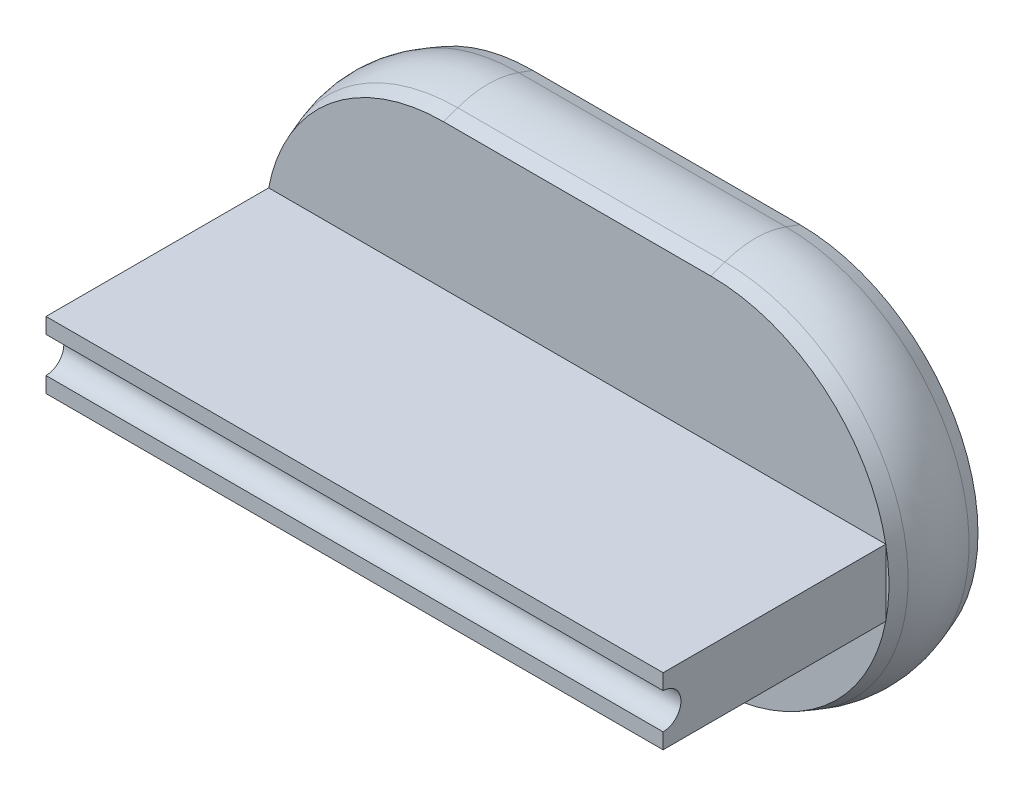
ISO-10303-21;
HEADER;
FILE_DESCRIPTION(('STEP AP214'),'2;1');
FILE_NAME('part.step','',(''),(''),'','','');
FILE_SCHEMA(('AUTOMOTIVE_DESIGN { 1 0 10303 214 1 1 1 1 }'));
ENDSEC;
DATA;
#1=APPLICATION_CONTEXT('core data for automotive mechanical design processes');
#2=APPLICATION_PROTOCOL_DEFINITION('international standard','automotive_design',2000,#1);
#3=PRODUCT_CONTEXT('',#1,'mechanical');
#4=PRODUCT('Part','Part','',(#3));
#5=PRODUCT_RELATED_PRODUCT_CATEGORY('part','',(#4));
#6=PRODUCT_DEFINITION_FORMATION('','',#4);
#7=PRODUCT_DEFINITION_CONTEXT('part definition',#1,'design');
#8=PRODUCT_DEFINITION('design','',#6,#7);
#9=PRODUCT_DEFINITION_SHAPE('','',#8);
#10=(LENGTH_UNIT() NAMED_UNIT(*) SI_UNIT(.MILLI.,.METRE.));
#11=(NAMED_UNIT(*) PLANE_ANGLE_UNIT() SI_UNIT($,.RADIAN.));
#12=(NAMED_UNIT(*) SI_UNIT($,.STERADIAN.) SOLID_ANGLE_UNIT());
#13=UNCERTAINTY_MEASURE_WITH_UNIT(LENGTH_MEASURE(1.E-05),#10,'distance_accuracy_value','');
#14=(GEOMETRIC_REPRESENTATION_CONTEXT(3) GLOBAL_UNCERTAINTY_ASSIGNED_CONTEXT((#13)) GLOBAL_UNIT_ASSIGNED_CONTEXT((#10,
#11,#12)) REPRESENTATION_CONTEXT('',''));
#15=CARTESIAN_POINT('',(0.,0.,0.));
#16=DIRECTION('',(0.,0.,1.));
#17=DIRECTION('',(1.,0.,0.));
#18=AXIS2_PLACEMENT_3D('',#15,#16,#17);
#19=CARTESIAN_POINT('',(-40.4386499904565,-3.75,25.));
#20=DIRECTION('',(1.,0.,0.));
#21=DIRECTION('',(0.,0.,-1.));
#22=AXIS2_PLACEMENT_3D('',#19,#20,#21);
#23=PLANE('',#22);
#24=CARTESIAN_POINT('',(-40.4386499904565,0.,25.));
#25=DIRECTION('',(1.,0.,0.));
#26=DIRECTION('',(0.,0.,-1.));
#27=AXIS2_PLACEMENT_3D('',#24,#25,#26);
#28=CIRCLE('',#27,2.);
#29=CARTESIAN_POINT('',(-40.4386499904565,-2.,25.));
#30=VERTEX_POINT('',#29);
#31=CARTESIAN_POINT('',(-40.4386499904565,2.,25.));
#32=VERTEX_POINT('',#31);
#33=EDGE_CURVE('E179',#30,#32,#28,.T.);
#34=ORIENTED_EDGE('',*,*,#33,.T.);
#35=DIRECTION('',(0.,-1.,0.));
#36=VECTOR('',#35,1.);
#37=CARTESIAN_POINT('',(-40.4386499904565,-3.75,25.));
#38=LINE('',#37,#36);
#39=CARTESIAN_POINT('',(-40.4386499904565,3.75,25.));
#40=VERTEX_POINT('',#39);
#41=EDGE_CURVE('E184',#40,#32,#38,.T.);
#42=ORIENTED_EDGE('',*,*,#41,.F.);
#43=DIRECTION('',(0.,0.,-1.));
#44=VECTOR('',#43,1.);
#45=CARTESIAN_POINT('',(-40.4386499904565,3.75,25.));
#46=LINE('',#45,#44);
#47=CARTESIAN_POINT('',(-40.4386499904565,3.75,0.));
#48=VERTEX_POINT('',#47);
#49=EDGE_CURVE('E189',#40,#48,#46,.T.);
#50=ORIENTED_EDGE('',*,*,#49,.T.);
#51=DIRECTION('',(0.,-1.,0.));
#52=VECTOR('',#51,1.);
#53=CARTESIAN_POINT('',(-40.4386499904565,-3.75,0.));
#54=LINE('',#53,#52);
#55=CARTESIAN_POINT('',(-40.4386499904565,-3.75,0.));
#56=VERTEX_POINT('',#55);
#57=EDGE_CURVE('E175',#48,#56,#54,.T.);
#58=ORIENTED_EDGE('',*,*,#57,.T.);
#59=DIRECTION('',(0.,0.,-1.));
#60=VECTOR('',#59,1.);
#61=CARTESIAN_POINT('',(-40.4386499904565,-3.75,25.));
#62=LINE('',#61,#60);
#63=CARTESIAN_POINT('',(-40.4386499904565,-3.75,25.));
#64=VERTEX_POINT('',#63);
#65=EDGE_CURVE('E208',#64,#56,#62,.T.);
#66=ORIENTED_EDGE('',*,*,#65,.F.);
#67=EDGE_CURVE('E186',#30,#64,#38,.T.);
#68=ORIENTED_EDGE('',*,*,#67,.F.);
#69=EDGE_LOOP('',(#34,#42,#50,#58,#66,#68));
#70=FACE_BOUND('',#69,.T.);
#71=ADVANCED_FACE('F34',(#70),#23,.F.);
#72=CARTESIAN_POINT('',(28.8519341232978,-3.75,25.));
#73=DIRECTION('',(-1.,0.,0.));
#74=DIRECTION('',(0.,0.,1.));
#75=AXIS2_PLACEMENT_3D('',#72,#73,#74);
#76=PLANE('',#75);
#77=CARTESIAN_POINT('',(28.8519341232978,0.,25.));
#78=DIRECTION('',(-1.,0.,0.));
#79=DIRECTION('',(0.,0.,1.));
#80=AXIS2_PLACEMENT_3D('',#77,#78,#79);
#81=CIRCLE('',#80,2.);
#82=CARTESIAN_POINT('',(28.8519341232978,-2.,25.));
#83=VERTEX_POINT('',#82);
#84=CARTESIAN_POINT('',(28.8519341232978,2.,25.));
#85=VERTEX_POINT('',#84);
#86=EDGE_CURVE('E171',#83,#85,#81,.F.);
#87=ORIENTED_EDGE('',*,*,#86,.F.);
#88=DIRECTION('',(0.,1.,0.));
#89=VECTOR('',#88,1.);
#90=CARTESIAN_POINT('',(28.8519341232978,-3.75,25.));
#91=LINE('',#90,#89);
#92=CARTESIAN_POINT('',(28.8519341232978,-3.75,25.));
#93=VERTEX_POINT('',#92);
#94=EDGE_CURVE('E159',#93,#83,#91,.T.);
#95=ORIENTED_EDGE('',*,*,#94,.F.);
#96=DIRECTION('',(0.,0.,-1.));
#97=VECTOR('',#96,1.);
#98=CARTESIAN_POINT('',(28.8519341232978,-3.75,25.));
#99=LINE('',#98,#97);
#100=CARTESIAN_POINT('',(28.8519341232978,-3.75,0.));
#101=VERTEX_POINT('',#100);
#102=EDGE_CURVE('E206',#93,#101,#99,.T.);
#103=ORIENTED_EDGE('',*,*,#102,.T.);
#104=DIRECTION('',(0.,1.,0.));
#105=VECTOR('',#104,1.);
#106=CARTESIAN_POINT('',(28.8519341232978,-3.75,0.));
#107=LINE('',#106,#105);
#108=CARTESIAN_POINT('',(28.8519341232978,3.75,0.));
#109=VERTEX_POINT('',#108);
#110=EDGE_CURVE('E195',#101,#109,#107,.T.);
#111=ORIENTED_EDGE('',*,*,#110,.T.);
#112=DIRECTION('',(0.,0.,-1.));
#113=VECTOR('',#112,1.);
#114=CARTESIAN_POINT('',(28.8519341232978,3.75,25.));
#115=LINE('',#114,#113);
#116=CARTESIAN_POINT('',(28.8519341232978,3.75,25.));
#117=VERTEX_POINT('',#116);
#118=EDGE_CURVE('E203',#117,#109,#115,.T.);
#119=ORIENTED_EDGE('',*,*,#118,.F.);
#120=EDGE_CURVE('E168',#85,#117,#91,.T.);
#121=ORIENTED_EDGE('',*,*,#120,.F.);
#122=EDGE_LOOP('',(#87,#95,#103,#111,#119,#121));
#123=FACE_BOUND('',#122,.T.);
#124=ADVANCED_FACE('F172',(#123),#76,.F.);
#125=CARTESIAN_POINT('',(0.,0.,25.));
#126=DIRECTION('',(0.,0.,-1.));
#127=DIRECTION('',(-1.,0.,0.));
#128=AXIS2_PLACEMENT_3D('',#125,#126,#127);
#129=PLANE('',#128);
#130=DIRECTION('',(1.,0.,0.));
#131=VECTOR('',#130,1.);
#132=CARTESIAN_POINT('',(-154.006190280749,2.,25.));
#133=LINE('',#132,#131);
#134=EDGE_CURVE('E51',#32,#85,#133,.T.);
#135=ORIENTED_EDGE('',*,*,#134,.T.);
#136=ORIENTED_EDGE('',*,*,#120,.T.);
#137=DIRECTION('',(-1.,0.,0.));
#138=VECTOR('',#137,1.);
#139=CARTESIAN_POINT('',(-40.4386499904565,3.75,25.));
#140=LINE('',#139,#138);
#141=EDGE_CURVE('E167',#117,#40,#140,.T.);
#142=ORIENTED_EDGE('',*,*,#141,.T.);
#143=ORIENTED_EDGE('',*,*,#41,.T.);
#144=EDGE_LOOP('',(#135,#136,#142,#143));
#145=FACE_BOUND('',#144,.T.);
#146=ADVANCED_FACE('F375',(#145),#129,.F.);
#147=DIRECTION('',(1.,0.,0.));
#148=VECTOR('',#147,1.);
#149=CARTESIAN_POINT('',(-154.006190280749,-2.,25.));
#150=LINE('',#149,#148);
#151=EDGE_CURVE('E59',#30,#83,#150,.T.);
#152=ORIENTED_EDGE('',*,*,#151,.F.);
#153=ORIENTED_EDGE('',*,*,#67,.T.);
#154=DIRECTION('',(1.,0.,0.));
#155=VECTOR('',#154,1.);
#156=CARTESIAN_POINT('',(-40.4386499904565,-3.75,25.));
#157=LINE('',#156,#155);
#158=EDGE_CURVE('E163',#64,#93,#157,.T.);
#159=ORIENTED_EDGE('',*,*,#158,.T.);
#160=ORIENTED_EDGE('',*,*,#94,.T.);
#161=EDGE_LOOP('',(#152,#153,#159,#160));
#162=FACE_BOUND('',#161,.T.);
#163=ADVANCED_FACE('F161',(#162),#129,.F.);
#164=CARTESIAN_POINT('',(-20.7933579335793,0.,0.));
#165=DIRECTION('',(0.,0.,1.));
#166=DIRECTION('',(1.,0.,0.));
#167=AXIS2_PLACEMENT_3D('',#164,#165,#166);
#168=PLANE('',#167);
#169=ORIENTED_EDGE('',*,*,#57,.F.);
#170=CARTESIAN_POINT('',(-20.7933579335793,0.,0.));
#171=DIRECTION('',(0.,0.,1.));
#172=DIRECTION('',(1.,0.,0.));
#173=AXIS2_PLACEMENT_3D('',#170,#171,#172);
#174=CIRCLE('',#173,20.);
#175=EDGE_CURVE('E275',#48,#56,#174,.T.);
#176=ORIENTED_EDGE('',*,*,#175,.T.);
#177=EDGE_LOOP('',(#169,#176));
#178=FACE_BOUND('',#177,.T.);
#179=ADVANCED_FACE('F390',(#178),#168,.T.);
#180=DIRECTION('',(-1.,0.,0.));
#181=VECTOR('',#180,1.);
#182=CARTESIAN_POINT('',(-40.4386499904565,3.75,0.));
#183=LINE('',#182,#181);
#184=EDGE_CURVE('E198',#109,#48,#183,.T.);
#185=ORIENTED_EDGE('',*,*,#184,.F.);
#186=CARTESIAN_POINT('',(9.20664206642069,0.,0.));
#187=DIRECTION('',(0.,0.,1.));
#188=DIRECTION('',(1.,0.,0.));
#189=AXIS2_PLACEMENT_3D('',#186,#187,#188);
#190=CIRCLE('',#189,20.);
#191=CARTESIAN_POINT('',(9.20664206642069,20.,0.));
#192=VERTEX_POINT('',#191);
#193=EDGE_CURVE('E278',#109,#192,#190,.T.);
#194=ORIENTED_EDGE('',*,*,#193,.T.);
#195=DIRECTION('',(-1.,0.,0.));
#196=VECTOR('',#195,1.);
#197=CARTESIAN_POINT('',(-20.7933579335793,20.,0.));
#198=LINE('',#197,#196);
#199=CARTESIAN_POINT('',(-20.7933579335793,20.,0.));
#200=VERTEX_POINT('',#199);
#201=EDGE_CURVE('E281',#192,#200,#198,.T.);
#202=ORIENTED_EDGE('',*,*,#201,.T.);
#203=EDGE_CURVE('E271',#200,#48,#174,.T.);
#204=ORIENTED_EDGE('',*,*,#203,.T.);
#205=EDGE_LOOP('',(#185,#194,#202,#204));
#206=FACE_BOUND('',#205,.T.);
#207=ADVANCED_FACE('F364',(#206),#168,.T.);
#208=ORIENTED_EDGE('',*,*,#110,.F.);
#209=EDGE_CURVE('E282',#101,#109,#190,.T.);
#210=ORIENTED_EDGE('',*,*,#209,.T.);
#211=EDGE_LOOP('',(#208,#210));
#212=FACE_BOUND('',#211,.T.);
#213=ADVANCED_FACE('F369',(#212),#168,.T.);
#214=CARTESIAN_POINT('',(-20.7933579335793,0.,0.));
#215=DIRECTION('',(0.,0.,-1.));
#216=DIRECTION('',(1.,0.,0.));
#217=AXIS2_PLACEMENT_3D('',#214,#215,#216);
#218=CONICAL_SURFACE('',#217,20.,0.349065850398867);
#219=DIRECTION('',(0.,0.342020143325669,-0.939692620785908));
#220=VECTOR('',#219,1.);
#221=CARTESIAN_POINT('',(-20.7933579335793,20.,0.));
#222=LINE('',#221,#220);
#223=CARTESIAN_POINT('',(-20.7933579335793,20.574999654431,-1.57979856674331));
#224=VERTEX_POINT('',#223);
#225=EDGE_CURVE('E286',#224,#200,#222,.F.);
#226=ORIENTED_EDGE('',*,*,#225,.F.);
#227=CARTESIAN_POINT('',(-20.7933579335793,0.,-1.5797985667433));
#228=DIRECTION('',(0.,0.,-1.));
#229=DIRECTION('',(-1.,0.,0.));
#230=AXIS2_PLACEMENT_3D('',#227,#228,#229);
#231=CIRCLE('',#230,20.574999654431);
#232=CARTESIAN_POINT('',(-20.7933579335793,-20.574999654431,-1.5797985667433));
#233=VERTEX_POINT('',#232);
#234=EDGE_CURVE('E305',#224,#233,#231,.F.);
#235=ORIENTED_EDGE('',*,*,#234,.T.);
#236=DIRECTION('',(0.,-0.342020143325669,-0.939692620785908));
#237=VECTOR('',#236,1.);
#238=CARTESIAN_POINT('',(-20.7933579335793,-20.,0.));
#239=LINE('',#238,#237);
#240=CARTESIAN_POINT('',(-20.7933579335793,-20.,0.));
#241=VERTEX_POINT('',#240);
#242=EDGE_CURVE('E285',#233,#241,#239,.F.);
#243=ORIENTED_EDGE('',*,*,#242,.T.);
#244=EDGE_CURVE('E265',#56,#241,#174,.T.);
#245=ORIENTED_EDGE('',*,*,#244,.F.);
#246=ORIENTED_EDGE('',*,*,#175,.F.);
#247=ORIENTED_EDGE('',*,*,#203,.F.);
#248=EDGE_LOOP('',(#226,#235,#243,#245,#246,#247));
#249=FACE_BOUND('',#248,.T.);
#250=ADVANCED_FACE('F386',(#249),#218,.T.);
#251=CARTESIAN_POINT('',(-20.7933579335793,20.,0.));
#252=DIRECTION('',(0.,0.939692620785908,0.342020143325669));
#253=DIRECTION('',(0.,-0.342020143325669,0.939692620785908));
#254=AXIS2_PLACEMENT_3D('',#251,#252,#253);
#255=PLANE('',#254);
#256=DIRECTION('',(0.,0.342020143325669,-0.939692620785908));
#257=VECTOR('',#256,1.);
#258=CARTESIAN_POINT('',(9.20664206642068,20.,0.));
#259=LINE('',#258,#257);
#260=CARTESIAN_POINT('',(9.20664206642068,20.574999654431,-1.57979856674331));
#261=VERTEX_POINT('',#260);
#262=EDGE_CURVE('E289',#261,#192,#259,.F.);
#263=ORIENTED_EDGE('',*,*,#262,.F.);
#264=DIRECTION('',(1.,0.,0.));
#265=VECTOR('',#264,1.);
#266=CARTESIAN_POINT('',(-20.7933579335793,20.574999654431,-1.57979856674331));
#267=LINE('',#266,#265);
#268=EDGE_CURVE('E43',#261,#224,#267,.F.);
#269=ORIENTED_EDGE('',*,*,#268,.T.);
#270=ORIENTED_EDGE('',*,*,#225,.T.);
#271=ORIENTED_EDGE('',*,*,#201,.F.);
#272=EDGE_LOOP('',(#263,#269,#270,#271));
#273=FACE_BOUND('',#272,.T.);
#274=ADVANCED_FACE('F361',(#273),#255,.T.);
#275=CARTESIAN_POINT('',(9.20664206642069,0.,0.));
#276=DIRECTION('',(0.,0.,-1.));
#277=DIRECTION('',(1.,0.,0.));
#278=AXIS2_PLACEMENT_3D('',#275,#276,#277);
#279=CONICAL_SURFACE('',#278,20.,0.349065850398867);
#280=DIRECTION('',(0.,-0.342020143325669,-0.939692620785908));
#281=VECTOR('',#280,1.);
#282=CARTESIAN_POINT('',(9.20664206642068,-20.,0.));
#283=LINE('',#282,#281);
#284=CARTESIAN_POINT('',(9.20664206642068,-20.574999654431,-1.57979856674331));
#285=VERTEX_POINT('',#284);
#286=CARTESIAN_POINT('',(9.20664206642068,-20.,0.));
#287=VERTEX_POINT('',#286);
#288=EDGE_CURVE('E292',#285,#287,#283,.F.);
#289=ORIENTED_EDGE('',*,*,#288,.F.);
#290=CARTESIAN_POINT('',(9.20664206642069,0.,-1.57979856674331));
#291=DIRECTION('',(0.,0.,-1.));
#292=DIRECTION('',(-1.,0.,0.));
#293=AXIS2_PLACEMENT_3D('',#290,#291,#292);
#294=CIRCLE('',#293,20.574999654431);
#295=EDGE_CURVE('E288',#285,#261,#294,.F.);
#296=ORIENTED_EDGE('',*,*,#295,.T.);
#297=ORIENTED_EDGE('',*,*,#262,.T.);
#298=ORIENTED_EDGE('',*,*,#193,.F.);
#299=ORIENTED_EDGE('',*,*,#209,.F.);
#300=EDGE_CURVE('E279',#287,#101,#190,.T.);
#301=ORIENTED_EDGE('',*,*,#300,.F.);
#302=EDGE_LOOP('',(#289,#296,#297,#298,#299,#301));
#303=FACE_BOUND('',#302,.T.);
#304=ADVANCED_FACE('F357',(#303),#279,.T.);
#305=CARTESIAN_POINT('',(-20.7933579335793,-20.,0.));
#306=DIRECTION('',(0.,-0.939692620785908,0.342020143325669));
#307=DIRECTION('',(0.,-0.342020143325669,-0.939692620785908));
#308=AXIS2_PLACEMENT_3D('',#305,#306,#307);
#309=PLANE('',#308);
#310=ORIENTED_EDGE('',*,*,#242,.F.);
#311=DIRECTION('',(-1.,0.,0.));
#312=VECTOR('',#311,1.);
#313=CARTESIAN_POINT('',(9.20664206642068,-20.574999654431,-1.57979856674331));
#314=LINE('',#313,#312);
#315=EDGE_CURVE('E301',#233,#285,#314,.F.);
#316=ORIENTED_EDGE('',*,*,#315,.T.);
#317=ORIENTED_EDGE('',*,*,#288,.T.);
#318=DIRECTION('',(1.,0.,0.));
#319=VECTOR('',#318,1.);
#320=CARTESIAN_POINT('',(-20.7933579335793,-20.,0.));
#321=LINE('',#320,#319);
#322=EDGE_CURVE('E274',#241,#287,#321,.T.);
#323=ORIENTED_EDGE('',*,*,#322,.F.);
#324=EDGE_LOOP('',(#310,#316,#317,#323));
#325=FACE_BOUND('',#324,.T.);
#326=ADVANCED_FACE('F401',(#325),#309,.T.);
#327=DIRECTION('',(1.,0.,0.));
#328=VECTOR('',#327,1.);
#329=CARTESIAN_POINT('',(-40.4386499904565,-3.75,0.));
#330=LINE('',#329,#328);
#331=EDGE_CURVE('E192',#56,#101,#330,.T.);
#332=ORIENTED_EDGE('',*,*,#331,.F.);
#333=ORIENTED_EDGE('',*,*,#244,.T.);
#334=ORIENTED_EDGE('',*,*,#322,.T.);
#335=ORIENTED_EDGE('',*,*,#300,.T.);
#336=EDGE_LOOP('',(#332,#333,#334,#335));
#337=FACE_BOUND('',#336,.T.);
#338=ADVANCED_FACE('F382',(#337),#168,.T.);
#339=CARTESIAN_POINT('',(-20.7933579335793,0.,-10.));
#340=DIRECTION('',(0.,0.,1.));
#341=DIRECTION('',(1.,0.,0.));
#342=AXIS2_PLACEMENT_3D('',#339,#340,#341);
#343=CONICAL_SURFACE('',#342,20.,0.349065850398867);
#344=DIRECTION('',(0.,-0.342020143325669,0.939692620785908));
#345=VECTOR('',#344,1.);
#346=CARTESIAN_POINT('',(-20.7933579335793,-20.,-10.));
#347=LINE('',#346,#345);
#348=CARTESIAN_POINT('',(-20.7933579335793,-20.574999654431,-8.4202014332567));
#349=VERTEX_POINT('',#348);
#350=CARTESIAN_POINT('',(-20.7933579335793,-20.,-10.));
#351=VERTEX_POINT('',#350);
#352=EDGE_CURVE('E263',#349,#351,#347,.F.);
#353=ORIENTED_EDGE('',*,*,#352,.F.);
#354=CARTESIAN_POINT('',(-20.7933579335793,0.,-8.42020143325669));
#355=DIRECTION('',(0.,0.,1.));
#356=DIRECTION('',(1.,0.,0.));
#357=AXIS2_PLACEMENT_3D('',#354,#355,#356);
#358=CIRCLE('',#357,20.574999654431);
#359=CARTESIAN_POINT('',(-20.7933579335793,20.574999654431,-8.4202014332567));
#360=VERTEX_POINT('',#359);
#361=EDGE_CURVE('E307',#349,#360,#358,.F.);
#362=ORIENTED_EDGE('',*,*,#361,.T.);
#363=DIRECTION('',(0.,0.342020143325669,0.939692620785908));
#364=VECTOR('',#363,1.);
#365=CARTESIAN_POINT('',(-20.7933579335793,20.,-10.));
#366=LINE('',#365,#364);
#367=CARTESIAN_POINT('',(-20.7933579335793,20.,-10.));
#368=VERTEX_POINT('',#367);
#369=EDGE_CURVE('E262',#360,#368,#366,.F.);
#370=ORIENTED_EDGE('',*,*,#369,.T.);
#371=CARTESIAN_POINT('',(-20.7933579335793,0.,-10.));
#372=DIRECTION('',(0.,0.,1.));
#373=DIRECTION('',(1.,0.,0.));
#374=AXIS2_PLACEMENT_3D('',#371,#372,#373);
#375=CIRCLE('',#374,20.);
#376=EDGE_CURVE('E250',#368,#351,#375,.T.);
#377=ORIENTED_EDGE('',*,*,#376,.T.);
#378=EDGE_LOOP('',(#353,#362,#370,#377));
#379=FACE_BOUND('',#378,.T.);
#380=ADVANCED_FACE('F331',(#379),#343,.T.);
#381=CARTESIAN_POINT('',(-20.7933579335793,-20.,-10.));
#382=DIRECTION('',(0.,-0.939692620785908,-0.342020143325669));
#383=DIRECTION('',(0.,0.342020143325669,-0.939692620785908));
#384=AXIS2_PLACEMENT_3D('',#381,#382,#383);
#385=PLANE('',#384);
#386=DIRECTION('',(0.,-0.342020143325669,0.939692620785908));
#387=VECTOR('',#386,1.);
#388=CARTESIAN_POINT('',(9.20664206642068,-20.,-10.));
#389=LINE('',#388,#387);
#390=CARTESIAN_POINT('',(9.20664206642068,-20.574999654431,-8.4202014332567));
#391=VERTEX_POINT('',#390);
#392=CARTESIAN_POINT('',(9.20664206642068,-20.,-10.));
#393=VERTEX_POINT('',#392);
#394=EDGE_CURVE('E266',#391,#393,#389,.F.);
#395=ORIENTED_EDGE('',*,*,#394,.F.);
#396=DIRECTION('',(1.,0.,0.));
#397=VECTOR('',#396,1.);
#398=CARTESIAN_POINT('',(-20.7933579335793,-20.574999654431,-8.4202014332567));
#399=LINE('',#398,#397);
#400=EDGE_CURVE('E303',#391,#349,#399,.F.);
#401=ORIENTED_EDGE('',*,*,#400,.T.);
#402=ORIENTED_EDGE('',*,*,#352,.T.);
#403=DIRECTION('',(1.,0.,0.));
#404=VECTOR('',#403,1.);
#405=CARTESIAN_POINT('',(-20.7933579335793,-20.,-10.));
#406=LINE('',#405,#404);
#407=EDGE_CURVE('E259',#351,#393,#406,.T.);
#408=ORIENTED_EDGE('',*,*,#407,.T.);
#409=EDGE_LOOP('',(#395,#401,#402,#408));
#410=FACE_BOUND('',#409,.T.);
#411=ADVANCED_FACE('F343',(#410),#385,.T.);
#412=CARTESIAN_POINT('',(9.20664206642069,0.,-10.));
#413=DIRECTION('',(0.,0.,1.));
#414=DIRECTION('',(1.,0.,0.));
#415=AXIS2_PLACEMENT_3D('',#412,#413,#414);
#416=CONICAL_SURFACE('',#415,20.,0.349065850398867);
#417=DIRECTION('',(0.,0.342020143325669,0.939692620785908));
#418=VECTOR('',#417,1.);
#419=CARTESIAN_POINT('',(9.20664206642069,20.,-10.));
#420=LINE('',#419,#418);
#421=CARTESIAN_POINT('',(9.20664206642069,20.574999654431,-8.4202014332567));
#422=VERTEX_POINT('',#421);
#423=CARTESIAN_POINT('',(9.20664206642069,20.,-10.));
#424=VERTEX_POINT('',#423);
#425=EDGE_CURVE('E268',#422,#424,#420,.F.);
#426=ORIENTED_EDGE('',*,*,#425,.F.);
#427=CARTESIAN_POINT('',(9.20664206642069,0.,-8.4202014332567));
#428=DIRECTION('',(0.,0.,1.));
#429=DIRECTION('',(1.,0.,0.));
#430=AXIS2_PLACEMENT_3D('',#427,#428,#429);
#431=CIRCLE('',#430,20.574999654431);
#432=EDGE_CURVE('E298',#422,#391,#431,.F.);
#433=ORIENTED_EDGE('',*,*,#432,.T.);
#434=ORIENTED_EDGE('',*,*,#394,.T.);
#435=CARTESIAN_POINT('',(9.20664206642069,0.,-10.));
#436=DIRECTION('',(0.,0.,1.));
#437=DIRECTION('',(1.,0.,0.));
#438=AXIS2_PLACEMENT_3D('',#435,#436,#437);
#439=CIRCLE('',#438,20.);
#440=EDGE_CURVE('E256',#393,#424,#439,.T.);
#441=ORIENTED_EDGE('',*,*,#440,.T.);
#442=EDGE_LOOP('',(#426,#433,#434,#441));
#443=FACE_BOUND('',#442,.T.);
#444=ADVANCED_FACE('F345',(#443),#416,.T.);
#445=CARTESIAN_POINT('',(-20.7933579335793,20.,-10.));
#446=DIRECTION('',(0.,0.939692620785908,-0.342020143325669));
#447=DIRECTION('',(0.,0.342020143325669,0.939692620785908));
#448=AXIS2_PLACEMENT_3D('',#445,#446,#447);
#449=PLANE('',#448);
#450=ORIENTED_EDGE('',*,*,#369,.F.);
#451=DIRECTION('',(-1.,0.,0.));
#452=VECTOR('',#451,1.);
#453=CARTESIAN_POINT('',(9.20664206642068,20.574999654431,-8.4202014332567));
#454=LINE('',#453,#452);
#455=EDGE_CURVE('E11',#360,#422,#454,.F.);
#456=ORIENTED_EDGE('',*,*,#455,.T.);
#457=ORIENTED_EDGE('',*,*,#425,.T.);
#458=DIRECTION('',(-1.,0.,0.));
#459=VECTOR('',#458,1.);
#460=CARTESIAN_POINT('',(-20.7933579335793,20.,-10.));
#461=LINE('',#460,#459);
#462=EDGE_CURVE('E253',#424,#368,#461,.T.);
#463=ORIENTED_EDGE('',*,*,#462,.T.);
#464=EDGE_LOOP('',(#450,#456,#457,#463));
#465=FACE_BOUND('',#464,.T.);
#466=ADVANCED_FACE('F333',(#465),#449,.T.);
#467=CARTESIAN_POINT('',(-20.7933579335793,0.,-10.));
#468=DIRECTION('',(0.,0.,-1.));
#469=DIRECTION('',(1.,0.,0.));
#470=AXIS2_PLACEMENT_3D('',#467,#468,#469);
#471=PLANE('',#470);
#472=CARTESIAN_POINT('',(17.429161642432,0.,-10.));
#473=DIRECTION('',(0.,0.,-1.));
#474=DIRECTION('',(-1.,0.,0.));
#475=AXIS2_PLACEMENT_3D('',#472,#473,#474);
#476=CIRCLE('',#475,6.72837901622849);
#477=CARTESIAN_POINT('',(17.429161642432,6.72837901622849,-10.));
#478=VERTEX_POINT('',#477);
#479=CARTESIAN_POINT('',(17.429161642432,-6.72837901622849,-10.));
#480=VERTEX_POINT('',#479);
#481=EDGE_CURVE('E217',#478,#480,#476,.T.);
#482=ORIENTED_EDGE('',*,*,#481,.F.);
#483=DIRECTION('',(1.,0.,0.));
#484=VECTOR('',#483,1.);
#485=CARTESIAN_POINT('',(17.429161642432,6.72837901622849,-10.));
#486=LINE('',#485,#484);
#487=CARTESIAN_POINT('',(2.89586296737856,6.72837901622849,-10.));
#488=VERTEX_POINT('',#487);
#489=EDGE_CURVE('E222',#488,#478,#486,.T.);
#490=ORIENTED_EDGE('',*,*,#489,.F.);
#491=CARTESIAN_POINT('',(2.89586296737856,0.,-10.));
#492=DIRECTION('',(0.,0.,-1.));
#493=DIRECTION('',(-1.,0.,0.));
#494=AXIS2_PLACEMENT_3D('',#491,#492,#493);
#495=CIRCLE('',#494,6.72837901622849);
#496=CARTESIAN_POINT('',(2.89586296737857,-6.72837901622849,-10.));
#497=VERTEX_POINT('',#496);
#498=EDGE_CURVE('E236',#497,#488,#495,.T.);
#499=ORIENTED_EDGE('',*,*,#498,.F.);
#500=DIRECTION('',(-1.,0.,0.));
#501=VECTOR('',#500,1.);
#502=CARTESIAN_POINT('',(17.429161642432,-6.72837901622849,-10.));
#503=LINE('',#502,#501);
#504=EDGE_CURVE('E233',#480,#497,#503,.T.);
#505=ORIENTED_EDGE('',*,*,#504,.F.);
#506=EDGE_LOOP('',(#482,#490,#499,#505));
#507=FACE_BOUND('',#506,.T.);
#508=ORIENTED_EDGE('',*,*,#376,.F.);
#509=ORIENTED_EDGE('',*,*,#462,.F.);
#510=ORIENTED_EDGE('',*,*,#440,.F.);
#511=ORIENTED_EDGE('',*,*,#407,.F.);
#512=EDGE_LOOP('',(#508,#509,#510,#511));
#513=FACE_BOUND('',#512,.T.);
#514=ADVANCED_FACE('F340',(#507,#513),#471,.T.);
#515=CARTESIAN_POINT('',(-20.7933579335793,0.,-5.));
#516=DIRECTION('',(0.,0.,-1.));
#517=DIRECTION('',(-1.,0.,0.));
#518=AXIS2_PLACEMENT_3D('',#515,#516,#517);
#519=TOROIDAL_SURFACE('',#518,11.1780734465719,10.);
#520=CARTESIAN_POINT('',(-20.7933579335793,11.1780734465719,-5.));
#521=DIRECTION('',(1.,0.,0.));
#522=DIRECTION('',(0.,0.,-1.));
#523=AXIS2_PLACEMENT_3D('',#520,#521,#522);
#524=CIRCLE('',#523,10.);
#525=EDGE_CURVE('E312',#360,#224,#524,.T.);
#526=ORIENTED_EDGE('',*,*,#525,.F.);
#527=ORIENTED_EDGE('',*,*,#361,.F.);
#528=CARTESIAN_POINT('',(-20.7933579335793,-11.1780734465719,-5.));
#529=DIRECTION('',(1.,0.,0.));
#530=DIRECTION('',(0.,0.,-1.));
#531=AXIS2_PLACEMENT_3D('',#528,#529,#530);
#532=CIRCLE('',#531,10.);
#533=EDGE_CURVE('E38',#233,#349,#532,.T.);
#534=ORIENTED_EDGE('',*,*,#533,.F.);
#535=ORIENTED_EDGE('',*,*,#234,.F.);
#536=EDGE_LOOP('',(#526,#527,#534,#535));
#537=FACE_BOUND('',#536,.T.);
#538=ADVANCED_FACE('F36',(#537),#519,.T.);
#539=CARTESIAN_POINT('',(-20.7933579335793,-11.1780734465719,-5.));
#540=DIRECTION('',(1.,0.,0.));
#541=DIRECTION('',(0.,0.,-1.));
#542=AXIS2_PLACEMENT_3D('',#539,#540,#541);
#543=CYLINDRICAL_SURFACE('',#542,10.);
#544=ORIENTED_EDGE('',*,*,#533,.T.);
#545=ORIENTED_EDGE('',*,*,#400,.F.);
#546=CARTESIAN_POINT('',(9.20664206642068,-11.1780734465719,-5.));
#547=DIRECTION('',(1.,0.,0.));
#548=DIRECTION('',(0.,0.,-1.));
#549=AXIS2_PLACEMENT_3D('',#546,#547,#548);
#550=CIRCLE('',#549,10.);
#551=EDGE_CURVE('E311',#285,#391,#550,.T.);
#552=ORIENTED_EDGE('',*,*,#551,.F.);
#553=ORIENTED_EDGE('',*,*,#315,.F.);
#554=EDGE_LOOP('',(#544,#545,#552,#553));
#555=FACE_BOUND('',#554,.T.);
#556=ADVANCED_FACE('F323',(#555),#543,.T.);
#557=CARTESIAN_POINT('',(-20.7933579335793,11.1780734465719,-5.));
#558=DIRECTION('',(-1.,0.,0.));
#559=DIRECTION('',(0.,0.,1.));
#560=AXIS2_PLACEMENT_3D('',#557,#558,#559);
#561=CYLINDRICAL_SURFACE('',#560,10.);
#562=ORIENTED_EDGE('',*,*,#525,.T.);
#563=ORIENTED_EDGE('',*,*,#268,.F.);
#564=CARTESIAN_POINT('',(9.20664206642069,11.1780734465719,-5.));
#565=DIRECTION('',(1.,0.,0.));
#566=DIRECTION('',(0.,0.,-1.));
#567=AXIS2_PLACEMENT_3D('',#564,#565,#566);
#568=CIRCLE('',#567,10.);
#569=EDGE_CURVE('E243',#422,#261,#568,.T.);
#570=ORIENTED_EDGE('',*,*,#569,.F.);
#571=ORIENTED_EDGE('',*,*,#455,.F.);
#572=EDGE_LOOP('',(#562,#563,#570,#571));
#573=FACE_BOUND('',#572,.T.);
#574=ADVANCED_FACE('F351',(#573),#561,.T.);
#575=CARTESIAN_POINT('',(9.20664206642069,0.,-5.));
#576=DIRECTION('',(0.,0.,-1.));
#577=DIRECTION('',(-1.,0.,0.));
#578=AXIS2_PLACEMENT_3D('',#575,#576,#577);
#579=TOROIDAL_SURFACE('',#578,11.1780734465719,10.);
#580=ORIENTED_EDGE('',*,*,#551,.T.);
#581=ORIENTED_EDGE('',*,*,#432,.F.);
#582=ORIENTED_EDGE('',*,*,#569,.T.);
#583=ORIENTED_EDGE('',*,*,#295,.F.);
#584=EDGE_LOOP('',(#580,#581,#582,#583));
#585=FACE_BOUND('',#584,.T.);
#586=ADVANCED_FACE('F349',(#585),#579,.T.);
#587=CARTESIAN_POINT('',(17.429161642432,0.,-9.5));
#588=DIRECTION('',(0.,0.,-1.));
#589=DIRECTION('',(-1.,0.,0.));
#590=AXIS2_PLACEMENT_3D('',#587,#588,#589);
#591=CYLINDRICAL_SURFACE('',#590,6.72837901622849);
#592=ORIENTED_EDGE('',*,*,#481,.T.);
#593=DIRECTION('',(0.,0.,-1.));
#594=VECTOR('',#593,1.);
#595=CARTESIAN_POINT('',(17.429161642432,-6.72837901622849,-9.5));
#596=LINE('',#595,#594);
#597=CARTESIAN_POINT('',(17.429161642432,-6.72837901622849,-9.5));
#598=VERTEX_POINT('',#597);
#599=EDGE_CURVE('E231',#598,#480,#596,.T.);
#600=ORIENTED_EDGE('',*,*,#599,.F.);
#601=CARTESIAN_POINT('',(17.429161642432,0.,-9.5));
#602=DIRECTION('',(0.,0.,-1.));
#603=DIRECTION('',(-1.,0.,0.));
#604=AXIS2_PLACEMENT_3D('',#601,#602,#603);
#605=CIRCLE('',#604,6.72837901622849);
#606=CARTESIAN_POINT('',(17.429161642432,6.72837901622849,-9.5));
#607=VERTEX_POINT('',#606);
#608=EDGE_CURVE('E218',#607,#598,#605,.T.);
#609=ORIENTED_EDGE('',*,*,#608,.F.);
#610=DIRECTION('',(0.,0.,-1.));
#611=VECTOR('',#610,1.);
#612=CARTESIAN_POINT('',(17.429161642432,6.72837901622849,-9.5));
#613=LINE('',#612,#611);
#614=EDGE_CURVE('E241',#607,#478,#613,.T.);
#615=ORIENTED_EDGE('',*,*,#614,.T.);
#616=EDGE_LOOP('',(#592,#600,#609,#615));
#617=FACE_BOUND('',#616,.T.);
#618=ADVANCED_FACE('F427',(#617),#591,.F.);
#619=CARTESIAN_POINT('',(17.429161642432,6.72837901622849,-9.5));
#620=DIRECTION('',(0.,1.,0.));
#621=DIRECTION('',(0.,0.,1.));
#622=AXIS2_PLACEMENT_3D('',#619,#620,#621);
#623=PLANE('',#622);
#624=ORIENTED_EDGE('',*,*,#489,.T.);
#625=ORIENTED_EDGE('',*,*,#614,.F.);
#626=DIRECTION('',(1.,0.,0.));
#627=VECTOR('',#626,1.);
#628=CARTESIAN_POINT('',(17.429161642432,6.72837901622849,-9.5));
#629=LINE('',#628,#627);
#630=CARTESIAN_POINT('',(2.89586296737856,6.72837901622849,-9.5));
#631=VERTEX_POINT('',#630);
#632=EDGE_CURVE('E228',#631,#607,#629,.T.);
#633=ORIENTED_EDGE('',*,*,#632,.F.);
#634=DIRECTION('',(0.,0.,-1.));
#635=VECTOR('',#634,1.);
#636=CARTESIAN_POINT('',(2.89586296737856,6.72837901622849,-9.5));
#637=LINE('',#636,#635);
#638=EDGE_CURVE('E244',#631,#488,#637,.T.);
#639=ORIENTED_EDGE('',*,*,#638,.T.);
#640=EDGE_LOOP('',(#624,#625,#633,#639));
#641=FACE_BOUND('',#640,.T.);
#642=ADVANCED_FACE('F423',(#641),#623,.F.);
#643=CARTESIAN_POINT('',(2.89586296737856,0.,-9.5));
#644=DIRECTION('',(0.,0.,-1.));
#645=DIRECTION('',(-1.,0.,0.));
#646=AXIS2_PLACEMENT_3D('',#643,#644,#645);
#647=CYLINDRICAL_SURFACE('',#646,6.72837901622849);
#648=ORIENTED_EDGE('',*,*,#498,.T.);
#649=ORIENTED_EDGE('',*,*,#638,.F.);
#650=CARTESIAN_POINT('',(2.89586296737856,0.,-9.5));
#651=DIRECTION('',(0.,0.,-1.));
#652=DIRECTION('',(-1.,0.,0.));
#653=AXIS2_PLACEMENT_3D('',#650,#651,#652);
#654=CIRCLE('',#653,6.72837901622849);
#655=CARTESIAN_POINT('',(2.89586296737857,-6.72837901622849,-9.5));
#656=VERTEX_POINT('',#655);
#657=EDGE_CURVE('E225',#656,#631,#654,.T.);
#658=ORIENTED_EDGE('',*,*,#657,.F.);
#659=DIRECTION('',(0.,0.,-1.));
#660=VECTOR('',#659,1.);
#661=CARTESIAN_POINT('',(2.89586296737857,-6.72837901622849,-9.5));
#662=LINE('',#661,#660);
#663=EDGE_CURVE('E246',#656,#497,#662,.T.);
#664=ORIENTED_EDGE('',*,*,#663,.T.);
#665=EDGE_LOOP('',(#648,#649,#658,#664));
#666=FACE_BOUND('',#665,.T.);
#667=ADVANCED_FACE('F426',(#666),#647,.F.);
#668=CARTESIAN_POINT('',(17.429161642432,-6.72837901622849,-9.5));
#669=DIRECTION('',(0.,-1.,0.));
#670=DIRECTION('',(0.,0.,-1.));
#671=AXIS2_PLACEMENT_3D('',#668,#669,#670);
#672=PLANE('',#671);
#673=ORIENTED_EDGE('',*,*,#504,.T.);
#674=ORIENTED_EDGE('',*,*,#663,.F.);
#675=DIRECTION('',(-1.,0.,0.));
#676=VECTOR('',#675,1.);
#677=CARTESIAN_POINT('',(17.429161642432,-6.72837901622849,-9.5));
#678=LINE('',#677,#676);
#679=EDGE_CURVE('E221',#598,#656,#678,.T.);
#680=ORIENTED_EDGE('',*,*,#679,.F.);
#681=ORIENTED_EDGE('',*,*,#599,.T.);
#682=EDGE_LOOP('',(#673,#674,#680,#681));
#683=FACE_BOUND('',#682,.T.);
#684=ADVANCED_FACE('F421',(#683),#672,.F.);
#685=CARTESIAN_POINT('',(17.429161642432,0.,-9.5));
#686=DIRECTION('',(0.,0.,-1.));
#687=DIRECTION('',(-1.,0.,0.));
#688=AXIS2_PLACEMENT_3D('',#685,#686,#687);
#689=PLANE('',#688);
#690=CARTESIAN_POINT('',(17.4499914703432,0.,-9.5));
#691=DIRECTION('',(0.,0.,-1.));
#692=DIRECTION('',(-1.,0.,0.));
#693=AXIS2_PLACEMENT_3D('',#690,#691,#692);
#694=CIRCLE('',#693,3.62848553796431);
#695=CARTESIAN_POINT('',(13.8215059323789,0.,-9.5));
#696=VERTEX_POINT('',#695);
#697=EDGE_CURVE('E211',#696,#696,#694,.T.);
#698=ORIENTED_EDGE('',*,*,#697,.F.);
#699=EDGE_LOOP('',(#698));
#700=FACE_BOUND('',#699,.T.);
#701=ORIENTED_EDGE('',*,*,#608,.T.);
#702=ORIENTED_EDGE('',*,*,#679,.T.);
#703=ORIENTED_EDGE('',*,*,#657,.T.);
#704=ORIENTED_EDGE('',*,*,#632,.T.);
#705=EDGE_LOOP('',(#701,#702,#703,#704));
#706=FACE_BOUND('',#705,.T.);
#707=ADVANCED_FACE('F417',(#700,#706),#689,.T.);
#708=CARTESIAN_POINT('',(17.4499914703432,0.,-9.5));
#709=DIRECTION('',(0.,0.,-1.));
#710=DIRECTION('',(-1.,0.,0.));
#711=AXIS2_PLACEMENT_3D('',#708,#709,#710);
#712=CONICAL_SURFACE('',#711,3.62848553796431,0.349065850398867);
#713=CARTESIAN_POINT('',(17.4499914703432,0.,-8.5));
#714=DIRECTION('',(0.,0.,-1.));
#715=DIRECTION('',(-1.,0.,0.));
#716=AXIS2_PLACEMENT_3D('',#713,#714,#715);
#717=CIRCLE('',#716,3.26451530369811);
#718=CARTESIAN_POINT('',(14.1854761666451,0.,-8.5));
#719=VERTEX_POINT('',#718);
#720=EDGE_CURVE('E214',#719,#719,#717,.T.);
#721=ORIENTED_EDGE('',*,*,#720,.F.);
#722=EDGE_LOOP('',(#721));
#723=FACE_BOUND('',#722,.T.);
#724=ORIENTED_EDGE('',*,*,#697,.T.);
#725=EDGE_LOOP('',(#724));
#726=FACE_BOUND('',#725,.T.);
#727=ADVANCED_FACE('F413',(#723,#726),#712,.F.);
#728=CARTESIAN_POINT('',(17.4499914703432,0.,-8.5));
#729=DIRECTION('',(0.,0.,-1.));
#730=DIRECTION('',(-1.,0.,0.));
#731=AXIS2_PLACEMENT_3D('',#728,#729,#730);
#732=PLANE('',#731);
#733=ORIENTED_EDGE('',*,*,#720,.T.);
#734=EDGE_LOOP('',(#733));
#735=FACE_BOUND('',#734,.T.);
#736=ADVANCED_FACE('F410',(#735),#732,.T.);
#737=CARTESIAN_POINT('',(-40.4386499904565,-3.75,25.));
#738=DIRECTION('',(0.,1.,0.));
#739=DIRECTION('',(-1.,0.,0.));
#740=AXIS2_PLACEMENT_3D('',#737,#738,#739);
#741=PLANE('',#740);
#742=ORIENTED_EDGE('',*,*,#331,.T.);
#743=ORIENTED_EDGE('',*,*,#102,.F.);
#744=ORIENTED_EDGE('',*,*,#158,.F.);
#745=ORIENTED_EDGE('',*,*,#65,.T.);
#746=EDGE_LOOP('',(#742,#743,#744,#745));
#747=FACE_BOUND('',#746,.T.);
#748=ADVANCED_FACE('F379',(#747),#741,.F.);
#749=CARTESIAN_POINT('',(-40.4386499904565,3.75,25.));
#750=DIRECTION('',(0.,-1.,0.));
#751=DIRECTION('',(1.,0.,0.));
#752=AXIS2_PLACEMENT_3D('',#749,#750,#751);
#753=PLANE('',#752);
#754=ORIENTED_EDGE('',*,*,#184,.T.);
#755=ORIENTED_EDGE('',*,*,#49,.F.);
#756=ORIENTED_EDGE('',*,*,#141,.F.);
#757=ORIENTED_EDGE('',*,*,#118,.T.);
#758=EDGE_LOOP('',(#754,#755,#756,#757));
#759=FACE_BOUND('',#758,.T.);
#760=ADVANCED_FACE('F372',(#759),#753,.F.);
#761=CARTESIAN_POINT('',(-154.006190280749,0.,25.));
#762=DIRECTION('',(1.,0.,0.));
#763=DIRECTION('',(0.,0.,-1.));
#764=AXIS2_PLACEMENT_3D('',#761,#762,#763);
#765=CYLINDRICAL_SURFACE('',#764,2.);
#766=ORIENTED_EDGE('',*,*,#151,.T.);
#767=ORIENTED_EDGE('',*,*,#86,.T.);
#768=ORIENTED_EDGE('',*,*,#134,.F.);
#769=ORIENTED_EDGE('',*,*,#33,.F.);
#770=EDGE_LOOP('',(#766,#767,#768,#769));
#771=FACE_BOUND('',#770,.T.);
#772=ADVANCED_FACE('F178',(#771),#765,.F.);
#773=CLOSED_SHELL('',(#71,#124,#146,#163,#179,#207,#213,#250,#274,#304,#326,#338,#380,#411,#444,
#466,#514,#538,#556,#574,#586,#618,#642,#667,#684,#707,#727,#736,#748,#760,#772));
#774=MANIFOLD_SOLID_BREP('B2',#773);
#775=ADVANCED_BREP_SHAPE_REPRESENTATION('',(#18,#774),#14);
#776=SHAPE_DEFINITION_REPRESENTATION(#9,#775);
ENDSEC;
END-ISO-10303-21;
